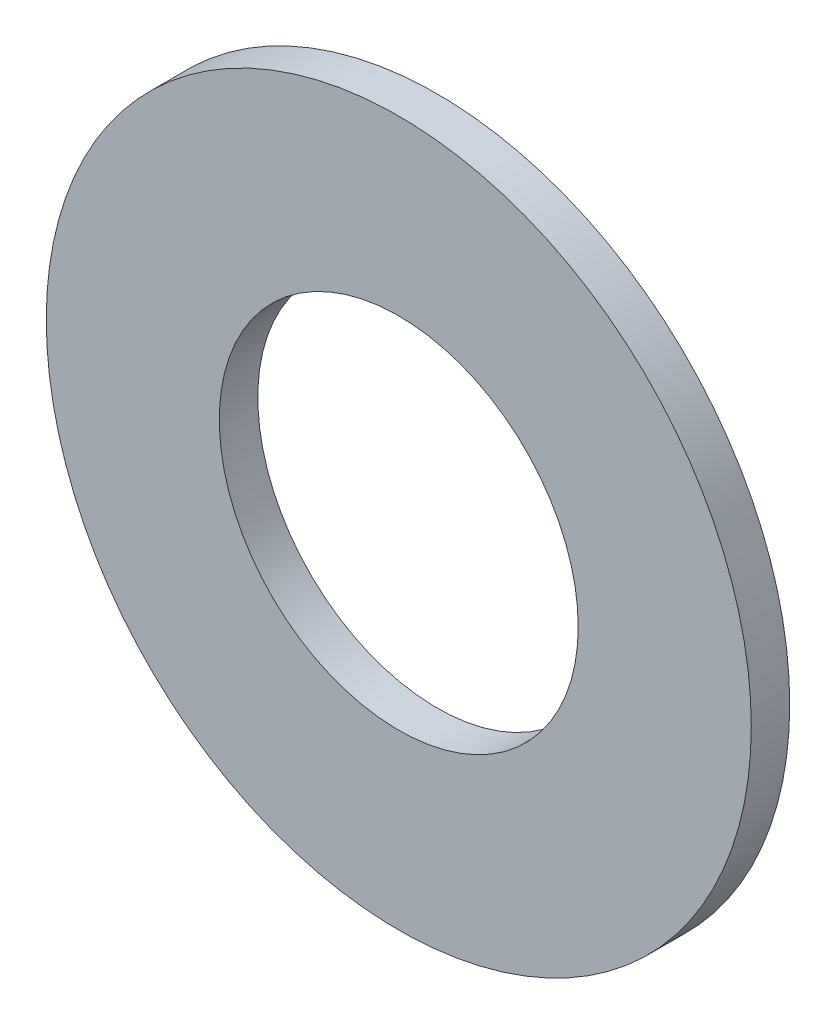
ISO-10303-21;
HEADER;
FILE_DESCRIPTION(('STEP AP214'),'2;1');
FILE_NAME('part.step','',(''),(''),'','','');
FILE_SCHEMA(('AUTOMOTIVE_DESIGN { 1 0 10303 214 1 1 1 1 }'));
ENDSEC;
DATA;
#1=APPLICATION_CONTEXT('core data for automotive mechanical design processes');
#2=APPLICATION_PROTOCOL_DEFINITION('international standard','automotive_design',2000,#1);
#3=PRODUCT_CONTEXT('',#1,'mechanical');
#4=PRODUCT('Part','Part','',(#3));
#5=PRODUCT_RELATED_PRODUCT_CATEGORY('part','',(#4));
#6=PRODUCT_DEFINITION_FORMATION('','',#4);
#7=PRODUCT_DEFINITION_CONTEXT('part definition',#1,'design');
#8=PRODUCT_DEFINITION('design','',#6,#7);
#9=PRODUCT_DEFINITION_SHAPE('','',#8);
#10=(LENGTH_UNIT() NAMED_UNIT(*) SI_UNIT(.MILLI.,.METRE.));
#11=(NAMED_UNIT(*) PLANE_ANGLE_UNIT() SI_UNIT($,.RADIAN.));
#12=(NAMED_UNIT(*) SI_UNIT($,.STERADIAN.) SOLID_ANGLE_UNIT());
#13=UNCERTAINTY_MEASURE_WITH_UNIT(LENGTH_MEASURE(1.E-05),#10,'distance_accuracy_value','');
#14=(GEOMETRIC_REPRESENTATION_CONTEXT(3) GLOBAL_UNCERTAINTY_ASSIGNED_CONTEXT((#13)) GLOBAL_UNIT_ASSIGNED_CONTEXT((#10,
#11,#12)) REPRESENTATION_CONTEXT('',''));
#15=CARTESIAN_POINT('',(0.,0.,0.));
#16=DIRECTION('',(0.,0.,1.));
#17=DIRECTION('',(1.,0.,0.));
#18=AXIS2_PLACEMENT_3D('',#15,#16,#17);
#19=CARTESIAN_POINT('',(0.,0.,3.));
#20=DIRECTION('',(0.,0.,1.));
#21=DIRECTION('',(1.,0.,0.));
#22=AXIS2_PLACEMENT_3D('',#19,#20,#21);
#23=PLANE('',#22);
#24=CARTESIAN_POINT('',(0.,0.,3.));
#25=DIRECTION('',(0.,0.,1.));
#26=DIRECTION('',(1.,0.,0.));
#27=AXIS2_PLACEMENT_3D('',#24,#25,#26);
#28=CIRCLE('',#27,27.5);
#29=CARTESIAN_POINT('',(27.5,0.,3.));
#30=VERTEX_POINT('',#29);
#31=EDGE_CURVE('E10',#30,#30,#28,.T.);
#32=ORIENTED_EDGE('',*,*,#31,.T.);
#33=EDGE_LOOP('',(#32));
#34=FACE_BOUND('',#33,.T.);
#35=CARTESIAN_POINT('',(0.,0.,3.));
#36=DIRECTION('',(0.,0.,1.));
#37=DIRECTION('',(1.,0.,0.));
#38=AXIS2_PLACEMENT_3D('',#35,#36,#37);
#39=CIRCLE('',#38,14.);
#40=CARTESIAN_POINT('',(14.,0.,3.));
#41=VERTEX_POINT('',#40);
#42=EDGE_CURVE('E46',#41,#41,#39,.T.);
#43=ORIENTED_EDGE('',*,*,#42,.F.);
#44=EDGE_LOOP('',(#43));
#45=FACE_BOUND('',#44,.T.);
#46=ADVANCED_FACE('F35',(#34,#45),#23,.T.);
#47=CARTESIAN_POINT('',(0.,0.,0.));
#48=DIRECTION('',(0.,0.,1.));
#49=DIRECTION('',(1.,0.,0.));
#50=AXIS2_PLACEMENT_3D('',#47,#48,#49);
#51=PLANE('',#50);
#52=CARTESIAN_POINT('',(0.,0.,0.));
#53=DIRECTION('',(0.,0.,1.));
#54=DIRECTION('',(1.,0.,0.));
#55=AXIS2_PLACEMENT_3D('',#52,#53,#54);
#56=CIRCLE('',#55,27.5);
#57=CARTESIAN_POINT('',(27.5,0.,0.));
#58=VERTEX_POINT('',#57);
#59=EDGE_CURVE('E39',#58,#58,#56,.T.);
#60=ORIENTED_EDGE('',*,*,#59,.F.);
#61=EDGE_LOOP('',(#60));
#62=FACE_BOUND('',#61,.T.);
#63=CARTESIAN_POINT('',(0.,0.,0.));
#64=DIRECTION('',(0.,0.,1.));
#65=DIRECTION('',(1.,0.,0.));
#66=AXIS2_PLACEMENT_3D('',#63,#64,#65);
#67=CIRCLE('',#66,14.);
#68=CARTESIAN_POINT('',(14.,0.,0.));
#69=VERTEX_POINT('',#68);
#70=EDGE_CURVE('E48',#69,#69,#67,.T.);
#71=ORIENTED_EDGE('',*,*,#70,.T.);
#72=EDGE_LOOP('',(#71));
#73=FACE_BOUND('',#72,.T.);
#74=ADVANCED_FACE('F58',(#62,#73),#51,.F.);
#75=CARTESIAN_POINT('',(0.,0.,3.));
#76=DIRECTION('',(0.,0.,-1.));
#77=DIRECTION('',(-1.,0.,0.));
#78=AXIS2_PLACEMENT_3D('',#75,#76,#77);
#79=CYLINDRICAL_SURFACE('',#78,27.5);
#80=ORIENTED_EDGE('',*,*,#31,.F.);
#81=EDGE_LOOP('',(#80));
#82=FACE_BOUND('',#81,.T.);
#83=ORIENTED_EDGE('',*,*,#59,.T.);
#84=EDGE_LOOP('',(#83));
#85=FACE_BOUND('',#84,.T.);
#86=ADVANCED_FACE('F37',(#82,#85),#79,.T.);
#87=CARTESIAN_POINT('',(0.,0.,3.));
#88=DIRECTION('',(0.,0.,-1.));
#89=DIRECTION('',(-1.,0.,0.));
#90=AXIS2_PLACEMENT_3D('',#87,#88,#89);
#91=CYLINDRICAL_SURFACE('',#90,14.);
#92=ORIENTED_EDGE('',*,*,#42,.T.);
#93=EDGE_LOOP('',(#92));
#94=FACE_BOUND('',#93,.T.);
#95=ORIENTED_EDGE('',*,*,#70,.F.);
#96=EDGE_LOOP('',(#95));
#97=FACE_BOUND('',#96,.T.);
#98=ADVANCED_FACE('F54',(#94,#97),#91,.F.);
#99=CLOSED_SHELL('',(#46,#74,#86,#98));
#100=MANIFOLD_SOLID_BREP('B2',#99);
#101=ADVANCED_BREP_SHAPE_REPRESENTATION('',(#18,#100),#14);
#102=SHAPE_DEFINITION_REPRESENTATION(#9,#101);
ENDSEC;
END-ISO-10303-21;
